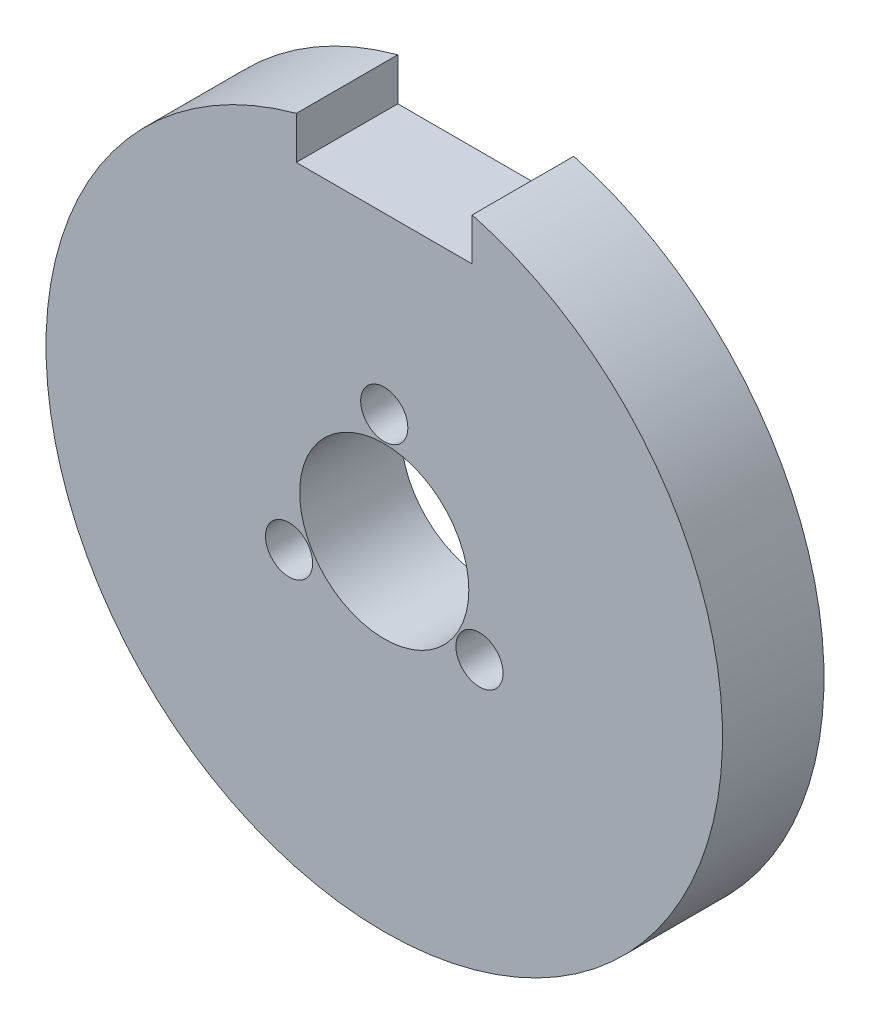
ISO-10303-21;
HEADER;
FILE_DESCRIPTION(('STEP AP214'),'2;1');
FILE_NAME('part.step','',(''),(''),'','','');
FILE_SCHEMA(('AUTOMOTIVE_DESIGN { 1 0 10303 214 1 1 1 1 }'));
ENDSEC;
DATA;
#1=APPLICATION_CONTEXT('core data for automotive mechanical design processes');
#2=APPLICATION_PROTOCOL_DEFINITION('international standard','automotive_design',2000,#1);
#3=PRODUCT_CONTEXT('',#1,'mechanical');
#4=PRODUCT('Part','Part','',(#3));
#5=PRODUCT_RELATED_PRODUCT_CATEGORY('part','',(#4));
#6=PRODUCT_DEFINITION_FORMATION('','',#4);
#7=PRODUCT_DEFINITION_CONTEXT('part definition',#1,'design');
#8=PRODUCT_DEFINITION('design','',#6,#7);
#9=PRODUCT_DEFINITION_SHAPE('','',#8);
#10=(LENGTH_UNIT() NAMED_UNIT(*) SI_UNIT(.MILLI.,.METRE.));
#11=(NAMED_UNIT(*) PLANE_ANGLE_UNIT() SI_UNIT($,.RADIAN.));
#12=(NAMED_UNIT(*) SI_UNIT($,.STERADIAN.) SOLID_ANGLE_UNIT());
#13=UNCERTAINTY_MEASURE_WITH_UNIT(LENGTH_MEASURE(1.E-05),#10,'distance_accuracy_value','');
#14=(GEOMETRIC_REPRESENTATION_CONTEXT(3) GLOBAL_UNCERTAINTY_ASSIGNED_CONTEXT((#13)) GLOBAL_UNIT_ASSIGNED_CONTEXT((#10,
#11,#12)) REPRESENTATION_CONTEXT('',''));
#15=CARTESIAN_POINT('',(0.,0.,0.));
#16=DIRECTION('',(0.,0.,1.));
#17=DIRECTION('',(1.,0.,0.));
#18=AXIS2_PLACEMENT_3D('',#15,#16,#17);
#19=CARTESIAN_POINT('',(0.,0.,6.));
#20=DIRECTION('',(0.,0.,-1.));
#21=DIRECTION('',(-1.,0.,0.));
#22=AXIS2_PLACEMENT_3D('',#19,#20,#21);
#23=CYLINDRICAL_SURFACE('',#22,20.);
#24=DIRECTION('',(0.,0.,-1.));
#25=VECTOR('',#24,1.);
#26=CARTESIAN_POINT('',(5.20000000002949,19.3121723273094,6.));
#27=LINE('',#26,#25);
#28=CARTESIAN_POINT('',(5.20000000002949,19.3121723273094,6.));
#29=VERTEX_POINT('',#28);
#30=CARTESIAN_POINT('',(5.20000000002949,19.3121723273094,0.));
#31=VERTEX_POINT('',#30);
#32=EDGE_CURVE('E68',#29,#31,#27,.T.);
#33=ORIENTED_EDGE('',*,*,#32,.F.);
#34=CARTESIAN_POINT('',(0.,0.,6.));
#35=DIRECTION('',(0.,0.,1.));
#36=DIRECTION('',(1.,0.,0.));
#37=AXIS2_PLACEMENT_3D('',#34,#35,#36);
#38=CIRCLE('',#37,20.);
#39=CARTESIAN_POINT('',(-5.19999999997051,19.3121723273252,6.));
#40=VERTEX_POINT('',#39);
#41=EDGE_CURVE('E12',#40,#29,#38,.T.);
#42=ORIENTED_EDGE('',*,*,#41,.F.);
#43=DIRECTION('',(0.,0.,-1.));
#44=VECTOR('',#43,1.);
#45=CARTESIAN_POINT('',(-5.19999999997051,19.3121723273252,6.));
#46=LINE('',#45,#44);
#47=CARTESIAN_POINT('',(-5.19999999997051,19.3121723273252,0.));
#48=VERTEX_POINT('',#47);
#49=EDGE_CURVE('E83',#40,#48,#46,.T.);
#50=ORIENTED_EDGE('',*,*,#49,.T.);
#51=CARTESIAN_POINT('',(0.,0.,0.));
#52=DIRECTION('',(0.,0.,1.));
#53=DIRECTION('',(1.,0.,0.));
#54=AXIS2_PLACEMENT_3D('',#51,#52,#53);
#55=CIRCLE('',#54,20.);
#56=EDGE_CURVE('E37',#48,#31,#55,.T.);
#57=ORIENTED_EDGE('',*,*,#56,.T.);
#58=EDGE_LOOP('',(#33,#42,#50,#57));
#59=FACE_BOUND('',#58,.T.);
#60=ADVANCED_FACE('F34',(#59),#23,.T.);
#61=CARTESIAN_POINT('',(0.,0.,6.));
#62=DIRECTION('',(0.,0.,1.));
#63=DIRECTION('',(1.,0.,0.));
#64=AXIS2_PLACEMENT_3D('',#61,#62,#63);
#65=PLANE('',#64);
#66=CARTESIAN_POINT('',(5.62916512460001,-3.24999999999933,6.));
#67=DIRECTION('',(0.,0.,1.));
#68=DIRECTION('',(1.,0.,0.));
#69=AXIS2_PLACEMENT_3D('',#66,#67,#68);
#70=CIRCLE('',#69,1.39385239690842);
#71=CARTESIAN_POINT('',(7.02301752150843,-3.24999999999933,6.));
#72=VERTEX_POINT('',#71);
#73=EDGE_CURVE('E109',#72,#72,#70,.T.);
#74=ORIENTED_EDGE('',*,*,#73,.F.);
#75=EDGE_LOOP('',(#74));
#76=FACE_BOUND('',#75,.T.);
#77=CARTESIAN_POINT('',(-5.6291651245977,-3.25000000000067,6.));
#78=DIRECTION('',(0.,0.,1.));
#79=DIRECTION('',(1.,0.,0.));
#80=AXIS2_PLACEMENT_3D('',#77,#78,#79);
#81=CIRCLE('',#80,1.39385239690884);
#82=CARTESIAN_POINT('',(-4.23531272768886,-3.25000000000067,6.));
#83=VERTEX_POINT('',#82);
#84=EDGE_CURVE('E102',#83,#83,#81,.T.);
#85=ORIENTED_EDGE('',*,*,#84,.F.);
#86=EDGE_LOOP('',(#85));
#87=FACE_BOUND('',#86,.T.);
#88=CARTESIAN_POINT('',(0.,6.5,6.));
#89=DIRECTION('',(0.,0.,1.));
#90=DIRECTION('',(1.,0.,0.));
#91=AXIS2_PLACEMENT_3D('',#88,#89,#90);
#92=CIRCLE('',#91,1.39385239690748);
#93=CARTESIAN_POINT('',(1.39385239690748,6.5,6.));
#94=VERTEX_POINT('',#93);
#95=EDGE_CURVE('E108',#94,#94,#92,.T.);
#96=ORIENTED_EDGE('',*,*,#95,.F.);
#97=EDGE_LOOP('',(#96));
#98=FACE_BOUND('',#97,.T.);
#99=CARTESIAN_POINT('',(0.,0.,6.));
#100=DIRECTION('',(0.,0.,1.));
#101=DIRECTION('',(1.,0.,0.));
#102=AXIS2_PLACEMENT_3D('',#99,#100,#101);
#103=CIRCLE('',#102,5.);
#104=CARTESIAN_POINT('',(5.,0.,6.));
#105=VERTEX_POINT('',#104);
#106=EDGE_CURVE('E120',#105,#105,#103,.T.);
#107=ORIENTED_EDGE('',*,*,#106,.F.);
#108=EDGE_LOOP('',(#107));
#109=FACE_BOUND('',#108,.T.);
#110=ORIENTED_EDGE('',*,*,#41,.T.);
#111=DIRECTION('',(0.,1.,0.));
#112=VECTOR('',#111,1.);
#113=CARTESIAN_POINT('',(5.20000000002949,0.,6.));
#114=LINE('',#113,#112);
#115=CARTESIAN_POINT('',(5.20000000002949,16.8000000300139,6.));
#116=VERTEX_POINT('',#115);
#117=EDGE_CURVE('E54',#116,#29,#114,.T.);
#118=ORIENTED_EDGE('',*,*,#117,.F.);
#119=DIRECTION('',(1.,0.,0.));
#120=VECTOR('',#119,1.);
#121=CARTESIAN_POINT('',(0.,16.8000000300139,6.));
#122=LINE('',#121,#120);
#123=CARTESIAN_POINT('',(-5.19999999997051,16.8000000300139,6.));
#124=VERTEX_POINT('',#123);
#125=EDGE_CURVE('E74',#124,#116,#122,.T.);
#126=ORIENTED_EDGE('',*,*,#125,.F.);
#127=DIRECTION('',(0.,-1.,0.));
#128=VECTOR('',#127,1.);
#129=CARTESIAN_POINT('',(-5.19999999997051,0.,6.));
#130=LINE('',#129,#128);
#131=EDGE_CURVE('E78',#40,#124,#130,.T.);
#132=ORIENTED_EDGE('',*,*,#131,.F.);
#133=EDGE_LOOP('',(#110,#118,#126,#132));
#134=FACE_BOUND('',#133,.T.);
#135=ADVANCED_FACE('F93',(#76,#87,#98,#109,#134),#65,.T.);
#136=CARTESIAN_POINT('',(0.,0.,0.));
#137=DIRECTION('',(0.,0.,1.));
#138=DIRECTION('',(1.,0.,0.));
#139=AXIS2_PLACEMENT_3D('',#136,#137,#138);
#140=PLANE('',#139);
#141=CARTESIAN_POINT('',(0.,0.,0.));
#142=DIRECTION('',(0.,0.,1.));
#143=DIRECTION('',(1.,0.,0.));
#144=AXIS2_PLACEMENT_3D('',#141,#142,#143);
#145=CIRCLE('',#144,5.);
#146=CARTESIAN_POINT('',(5.,0.,0.));
#147=VERTEX_POINT('',#146);
#148=EDGE_CURVE('E123',#147,#147,#145,.T.);
#149=ORIENTED_EDGE('',*,*,#148,.T.);
#150=EDGE_LOOP('',(#149));
#151=FACE_BOUND('',#150,.T.);
#152=CARTESIAN_POINT('',(0.,6.5,0.));
#153=DIRECTION('',(0.,0.,1.));
#154=DIRECTION('',(1.,0.,0.));
#155=AXIS2_PLACEMENT_3D('',#152,#153,#154);
#156=CIRCLE('',#155,1.39385239690748);
#157=CARTESIAN_POINT('',(1.39385239690748,6.5,0.));
#158=VERTEX_POINT('',#157);
#159=EDGE_CURVE('E117',#158,#158,#156,.T.);
#160=ORIENTED_EDGE('',*,*,#159,.T.);
#161=EDGE_LOOP('',(#160));
#162=FACE_BOUND('',#161,.T.);
#163=CARTESIAN_POINT('',(-5.6291651245977,-3.25000000000067,0.));
#164=DIRECTION('',(0.,0.,1.));
#165=DIRECTION('',(1.,0.,0.));
#166=AXIS2_PLACEMENT_3D('',#163,#164,#165);
#167=CIRCLE('',#166,1.39385239690884);
#168=CARTESIAN_POINT('',(-4.23531272768886,-3.25000000000067,0.));
#169=VERTEX_POINT('',#168);
#170=EDGE_CURVE('E112',#169,#169,#167,.T.);
#171=ORIENTED_EDGE('',*,*,#170,.T.);
#172=EDGE_LOOP('',(#171));
#173=FACE_BOUND('',#172,.T.);
#174=CARTESIAN_POINT('',(5.62916512460001,-3.24999999999933,0.));
#175=DIRECTION('',(0.,0.,1.));
#176=DIRECTION('',(1.,0.,0.));
#177=AXIS2_PLACEMENT_3D('',#174,#175,#176);
#178=CIRCLE('',#177,1.39385239690842);
#179=CARTESIAN_POINT('',(7.02301752150843,-3.24999999999933,0.));
#180=VERTEX_POINT('',#179);
#181=EDGE_CURVE('E105',#180,#180,#178,.T.);
#182=ORIENTED_EDGE('',*,*,#181,.T.);
#183=EDGE_LOOP('',(#182));
#184=FACE_BOUND('',#183,.T.);
#185=DIRECTION('',(0.,1.,0.));
#186=VECTOR('',#185,1.);
#187=CARTESIAN_POINT('',(5.20000000002949,0.,0.));
#188=LINE('',#187,#186);
#189=CARTESIAN_POINT('',(5.20000000002949,16.8000000300139,0.));
#190=VERTEX_POINT('',#189);
#191=EDGE_CURVE('E48',#190,#31,#188,.T.);
#192=ORIENTED_EDGE('',*,*,#191,.T.);
#193=ORIENTED_EDGE('',*,*,#56,.F.);
#194=DIRECTION('',(0.,-1.,0.));
#195=VECTOR('',#194,1.);
#196=CARTESIAN_POINT('',(-5.19999999997051,0.,0.));
#197=LINE('',#196,#195);
#198=CARTESIAN_POINT('',(-5.19999999997051,16.8000000300139,0.));
#199=VERTEX_POINT('',#198);
#200=EDGE_CURVE('E95',#48,#199,#197,.T.);
#201=ORIENTED_EDGE('',*,*,#200,.T.);
#202=DIRECTION('',(1.,0.,0.));
#203=VECTOR('',#202,1.);
#204=CARTESIAN_POINT('',(0.,16.8000000300139,0.));
#205=LINE('',#204,#203);
#206=EDGE_CURVE('E90',#199,#190,#205,.T.);
#207=ORIENTED_EDGE('',*,*,#206,.T.);
#208=EDGE_LOOP('',(#192,#193,#201,#207));
#209=FACE_BOUND('',#208,.T.);
#210=ADVANCED_FACE('F132',(#151,#162,#173,#184,#209),#140,.F.);
#211=CARTESIAN_POINT('',(0.,0.,0.));
#212=DIRECTION('',(0.,0.,1.));
#213=DIRECTION('',(1.,0.,0.));
#214=AXIS2_PLACEMENT_3D('',#211,#212,#213);
#215=CYLINDRICAL_SURFACE('',#214,5.);
#216=ORIENTED_EDGE('',*,*,#148,.F.);
#217=EDGE_LOOP('',(#216));
#218=FACE_BOUND('',#217,.T.);
#219=ORIENTED_EDGE('',*,*,#106,.T.);
#220=EDGE_LOOP('',(#219));
#221=FACE_BOUND('',#220,.T.);
#222=ADVANCED_FACE('F129',(#218,#221),#215,.F.);
#223=CARTESIAN_POINT('',(0.,6.5,0.));
#224=DIRECTION('',(0.,0.,1.));
#225=DIRECTION('',(1.,0.,0.));
#226=AXIS2_PLACEMENT_3D('',#223,#224,#225);
#227=CYLINDRICAL_SURFACE('',#226,1.39385239690748);
#228=ORIENTED_EDGE('',*,*,#159,.F.);
#229=EDGE_LOOP('',(#228));
#230=FACE_BOUND('',#229,.T.);
#231=ORIENTED_EDGE('',*,*,#95,.T.);
#232=EDGE_LOOP('',(#231));
#233=FACE_BOUND('',#232,.T.);
#234=ADVANCED_FACE('F146',(#230,#233),#227,.F.);
#235=CARTESIAN_POINT('',(-5.6291651245977,-3.25000000000067,0.));
#236=DIRECTION('',(0.,0.,1.));
#237=DIRECTION('',(1.,0.,0.));
#238=AXIS2_PLACEMENT_3D('',#235,#236,#237);
#239=CYLINDRICAL_SURFACE('',#238,1.39385239690884);
#240=ORIENTED_EDGE('',*,*,#170,.F.);
#241=EDGE_LOOP('',(#240));
#242=FACE_BOUND('',#241,.T.);
#243=ORIENTED_EDGE('',*,*,#84,.T.);
#244=EDGE_LOOP('',(#243));
#245=FACE_BOUND('',#244,.T.);
#246=ADVANCED_FACE('F150',(#242,#245),#239,.F.);
#247=CARTESIAN_POINT('',(5.62916512460001,-3.24999999999933,0.));
#248=DIRECTION('',(0.,0.,1.));
#249=DIRECTION('',(1.,0.,0.));
#250=AXIS2_PLACEMENT_3D('',#247,#248,#249);
#251=CYLINDRICAL_SURFACE('',#250,1.39385239690842);
#252=ORIENTED_EDGE('',*,*,#181,.F.);
#253=EDGE_LOOP('',(#252));
#254=FACE_BOUND('',#253,.T.);
#255=ORIENTED_EDGE('',*,*,#73,.T.);
#256=EDGE_LOOP('',(#255));
#257=FACE_BOUND('',#256,.T.);
#258=ADVANCED_FACE('F154',(#254,#257),#251,.F.);
#259=CARTESIAN_POINT('',(5.20000000002949,0.,6.));
#260=DIRECTION('',(-1.,0.,0.));
#261=DIRECTION('',(0.,0.,1.));
#262=AXIS2_PLACEMENT_3D('',#259,#260,#261);
#263=PLANE('',#262);
#264=ORIENTED_EDGE('',*,*,#191,.F.);
#265=DIRECTION('',(0.,0.,-1.));
#266=VECTOR('',#265,1.);
#267=CARTESIAN_POINT('',(5.20000000002949,16.8000000300139,6.));
#268=LINE('',#267,#266);
#269=EDGE_CURVE('E86',#116,#190,#268,.T.);
#270=ORIENTED_EDGE('',*,*,#269,.F.);
#271=ORIENTED_EDGE('',*,*,#117,.T.);
#272=ORIENTED_EDGE('',*,*,#32,.T.);
#273=EDGE_LOOP('',(#264,#270,#271,#272));
#274=FACE_BOUND('',#273,.T.);
#275=ADVANCED_FACE('F158',(#274),#263,.T.);
#276=CARTESIAN_POINT('',(-5.19999999997051,0.,6.));
#277=DIRECTION('',(1.,0.,0.));
#278=DIRECTION('',(0.,0.,-1.));
#279=AXIS2_PLACEMENT_3D('',#276,#277,#278);
#280=PLANE('',#279);
#281=ORIENTED_EDGE('',*,*,#200,.F.);
#282=ORIENTED_EDGE('',*,*,#49,.F.);
#283=ORIENTED_EDGE('',*,*,#131,.T.);
#284=DIRECTION('',(0.,0.,-1.));
#285=VECTOR('',#284,1.);
#286=CARTESIAN_POINT('',(-5.19999999997051,16.8000000300139,6.));
#287=LINE('',#286,#285);
#288=EDGE_CURVE('E80',#124,#199,#287,.T.);
#289=ORIENTED_EDGE('',*,*,#288,.T.);
#290=EDGE_LOOP('',(#281,#282,#283,#289));
#291=FACE_BOUND('',#290,.T.);
#292=ADVANCED_FACE('F79',(#291),#280,.T.);
#293=CARTESIAN_POINT('',(0.,16.8000000300139,6.));
#294=DIRECTION('',(0.,1.,0.));
#295=DIRECTION('',(0.,0.,1.));
#296=AXIS2_PLACEMENT_3D('',#293,#294,#295);
#297=PLANE('',#296);
#298=ORIENTED_EDGE('',*,*,#206,.F.);
#299=ORIENTED_EDGE('',*,*,#288,.F.);
#300=ORIENTED_EDGE('',*,*,#125,.T.);
#301=ORIENTED_EDGE('',*,*,#269,.T.);
#302=EDGE_LOOP('',(#298,#299,#300,#301));
#303=FACE_BOUND('',#302,.T.);
#304=ADVANCED_FACE('F88',(#303),#297,.T.);
#305=CLOSED_SHELL('',(#60,#135,#210,#222,#234,#246,#258,#275,#292,#304));
#306=MANIFOLD_SOLID_BREP('B2',#305);
#307=ADVANCED_BREP_SHAPE_REPRESENTATION('',(#18,#306),#14);
#308=SHAPE_DEFINITION_REPRESENTATION(#9,#307);
ENDSEC;
END-ISO-10303-21;
